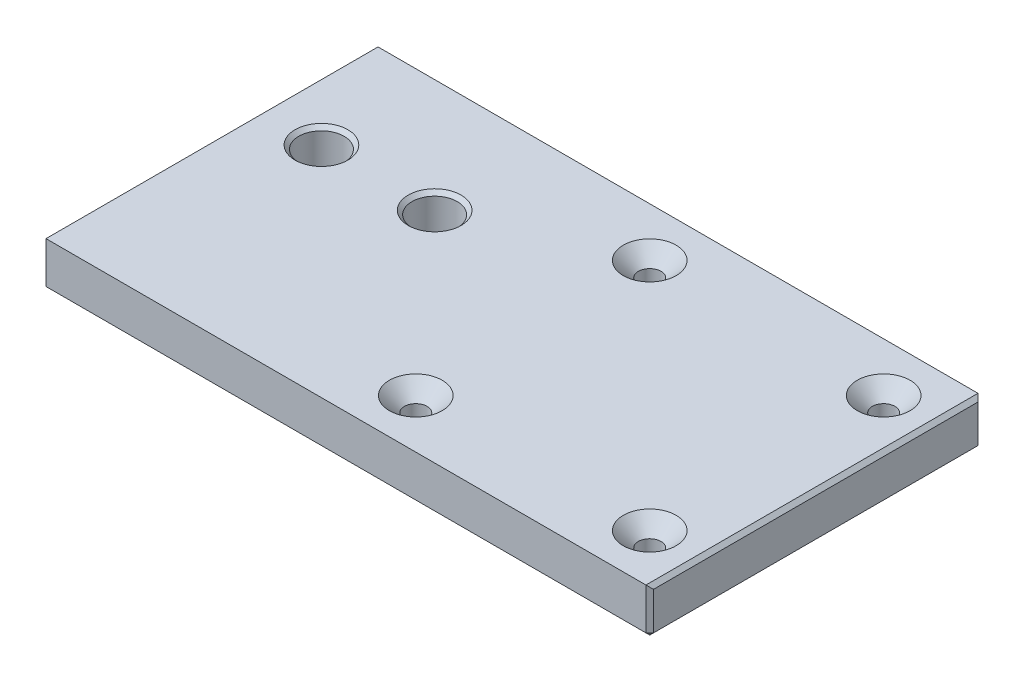
ISO-10303-21;
HEADER;
FILE_DESCRIPTION(('STEP AP214'),'2;1');
FILE_NAME('part.step','',(''),(''),'','','');
FILE_SCHEMA(('AUTOMOTIVE_DESIGN { 1 0 10303 214 1 1 1 1 }'));
ENDSEC;
DATA;
#1=APPLICATION_CONTEXT('core data for automotive mechanical design processes');
#2=APPLICATION_PROTOCOL_DEFINITION('international standard','automotive_design',2000,#1);
#3=PRODUCT_CONTEXT('',#1,'mechanical');
#4=PRODUCT('Part','Part','',(#3));
#5=PRODUCT_RELATED_PRODUCT_CATEGORY('part','',(#4));
#6=PRODUCT_DEFINITION_FORMATION('','',#4);
#7=PRODUCT_DEFINITION_CONTEXT('part definition',#1,'design');
#8=PRODUCT_DEFINITION('design','',#6,#7);
#9=PRODUCT_DEFINITION_SHAPE('','',#8);
#10=(LENGTH_UNIT() NAMED_UNIT(*) SI_UNIT(.MILLI.,.METRE.));
#11=(NAMED_UNIT(*) PLANE_ANGLE_UNIT() SI_UNIT($,.RADIAN.));
#12=(NAMED_UNIT(*) SI_UNIT($,.STERADIAN.) SOLID_ANGLE_UNIT());
#13=UNCERTAINTY_MEASURE_WITH_UNIT(LENGTH_MEASURE(1.E-05),#10,'distance_accuracy_value','');
#14=(GEOMETRIC_REPRESENTATION_CONTEXT(3) GLOBAL_UNCERTAINTY_ASSIGNED_CONTEXT((#13)) GLOBAL_UNIT_ASSIGNED_CONTEXT((#10,
#11,#12)) REPRESENTATION_CONTEXT('',''));
#15=CARTESIAN_POINT('',(0.,0.,0.));
#16=DIRECTION('',(0.,0.,1.));
#17=DIRECTION('',(1.,0.,0.));
#18=AXIS2_PLACEMENT_3D('',#15,#16,#17);
#19=CARTESIAN_POINT('',(0.,6.,0.));
#20=DIRECTION('',(0.,1.,0.));
#21=DIRECTION('',(0.,0.,1.));
#22=AXIS2_PLACEMENT_3D('',#19,#20,#21);
#23=PLANE('',#22);
#24=CARTESIAN_POINT('',(41.2716863076412,6.,16.7214611872146));
#25=DIRECTION('',(0.,1.,0.));
#26=DIRECTION('',(0.,0.,1.));
#27=AXIS2_PLACEMENT_3D('',#24,#25,#26);
#28=CIRCLE('',#27,3.50000000000002);
#29=CARTESIAN_POINT('',(41.2716863076412,6.,20.2214611872146));
#30=VERTEX_POINT('',#29);
#31=EDGE_CURVE('E266',#30,#30,#28,.F.);
#32=ORIENTED_EDGE('',*,*,#31,.T.);
#33=EDGE_LOOP('',(#32));
#34=FACE_BOUND('',#33,.T.);
#35=CARTESIAN_POINT('',(41.2716863076412,6.,-14.2785388127854));
#36=DIRECTION('',(0.,1.,0.));
#37=DIRECTION('',(0.,0.,1.));
#38=AXIS2_PLACEMENT_3D('',#35,#36,#37);
#39=CIRCLE('',#38,3.50000000000002);
#40=CARTESIAN_POINT('',(41.2716863076412,6.,-10.7785388127854));
#41=VERTEX_POINT('',#40);
#42=EDGE_CURVE('E263',#41,#41,#39,.F.);
#43=ORIENTED_EDGE('',*,*,#42,.T.);
#44=EDGE_LOOP('',(#43));
#45=FACE_BOUND('',#44,.T.);
#46=CARTESIAN_POINT('',(10.2716863076412,6.,16.7214611872146));
#47=DIRECTION('',(0.,1.,0.));
#48=DIRECTION('',(0.,0.,1.));
#49=AXIS2_PLACEMENT_3D('',#46,#47,#48);
#50=CIRCLE('',#49,3.50000000000002);
#51=CARTESIAN_POINT('',(10.2716863076412,6.,20.2214611872146));
#52=VERTEX_POINT('',#51);
#53=EDGE_CURVE('E260',#52,#52,#50,.F.);
#54=ORIENTED_EDGE('',*,*,#53,.T.);
#55=EDGE_LOOP('',(#54));
#56=FACE_BOUND('',#55,.T.);
#57=CARTESIAN_POINT('',(10.2716863076412,6.,-14.2785388127854));
#58=DIRECTION('',(0.,1.,0.));
#59=DIRECTION('',(0.,0.,1.));
#60=AXIS2_PLACEMENT_3D('',#57,#58,#59);
#61=CIRCLE('',#60,3.50000000000002);
#62=CARTESIAN_POINT('',(10.2716863076412,6.,-10.7785388127854));
#63=VERTEX_POINT('',#62);
#64=EDGE_CURVE('E257',#63,#63,#61,.F.);
#65=ORIENTED_EDGE('',*,*,#64,.T.);
#66=EDGE_LOOP('',(#65));
#67=FACE_BOUND('',#66,.T.);
#68=CARTESIAN_POINT('',(-9.72831369235883,6.,-5.77853881278539));
#69=DIRECTION('',(0.,1.,0.));
#70=DIRECTION('',(0.,0.,1.));
#71=AXIS2_PLACEMENT_3D('',#68,#69,#70);
#72=CIRCLE('',#71,3.49999999999999);
#73=CARTESIAN_POINT('',(-9.72831369235883,6.,-2.2785388127854));
#74=VERTEX_POINT('',#73);
#75=EDGE_CURVE('E193',#74,#74,#72,.F.);
#76=ORIENTED_EDGE('',*,*,#75,.T.);
#77=EDGE_LOOP('',(#76));
#78=FACE_BOUND('',#77,.T.);
#79=CARTESIAN_POINT('',(-24.7283136923588,6.,-5.77853881278539));
#80=DIRECTION('',(0.,1.,0.));
#81=DIRECTION('',(0.,0.,1.));
#82=AXIS2_PLACEMENT_3D('',#79,#80,#81);
#83=CIRCLE('',#82,3.49999999999999);
#84=CARTESIAN_POINT('',(-24.7283136923588,6.,-2.2785388127854));
#85=VERTEX_POINT('',#84);
#86=EDGE_CURVE('E190',#85,#85,#83,.F.);
#87=ORIENTED_EDGE('',*,*,#86,.T.);
#88=EDGE_LOOP('',(#87));
#89=FACE_BOUND('',#88,.T.);
#90=DIRECTION('',(-1.,0.,0.));
#91=VECTOR('',#90,1.);
#92=CARTESIAN_POINT('',(-32.7283136923588,6.,-20.7785388127854));
#93=LINE('',#92,#91);
#94=CARTESIAN_POINT('',(47.2716863076412,6.,-20.7785388127854));
#95=VERTEX_POINT('',#94);
#96=CARTESIAN_POINT('',(-32.2283136923588,6.,-20.7785388127854));
#97=VERTEX_POINT('',#96);
#98=EDGE_CURVE('E465',#95,#97,#93,.T.);
#99=ORIENTED_EDGE('',*,*,#98,.T.);
#100=DIRECTION('',(0.,0.,1.));
#101=VECTOR('',#100,1.);
#102=CARTESIAN_POINT('',(-32.2283136923588,6.,23.2214611872146));
#103=LINE('',#102,#101);
#104=CARTESIAN_POINT('',(-32.2283136923588,6.,23.2214611872146));
#105=VERTEX_POINT('',#104);
#106=EDGE_CURVE('E198',#97,#105,#103,.T.);
#107=ORIENTED_EDGE('',*,*,#106,.T.);
#108=DIRECTION('',(1.,0.,0.));
#109=VECTOR('',#108,1.);
#110=CARTESIAN_POINT('',(-32.7283136923588,6.,23.2214611872146));
#111=LINE('',#110,#109);
#112=CARTESIAN_POINT('',(47.2716863076412,6.,23.2214611872146));
#113=VERTEX_POINT('',#112);
#114=EDGE_CURVE('E254',#105,#113,#111,.T.);
#115=ORIENTED_EDGE('',*,*,#114,.T.);
#116=DIRECTION('',(0.,0.,-1.));
#117=VECTOR('',#116,1.);
#118=CARTESIAN_POINT('',(47.2716863076412,6.,-20.7785388127854));
#119=LINE('',#118,#117);
#120=EDGE_CURVE('E196',#113,#95,#119,.T.);
#121=ORIENTED_EDGE('',*,*,#120,.T.);
#122=EDGE_LOOP('',(#99,#107,#115,#121));
#123=FACE_BOUND('',#122,.T.);
#124=ADVANCED_FACE('F33',(#34,#45,#56,#67,#78,#89,#123),#23,.T.);
#125=CARTESIAN_POINT('',(0.,0.,0.));
#126=DIRECTION('',(0.,1.,0.));
#127=DIRECTION('',(0.,0.,1.));
#128=AXIS2_PLACEMENT_3D('',#125,#126,#127);
#129=PLANE('',#128);
#130=CARTESIAN_POINT('',(-9.72831369235883,0.,-5.77853881278539));
#131=DIRECTION('',(0.,1.,0.));
#132=DIRECTION('',(0.,0.,1.));
#133=AXIS2_PLACEMENT_3D('',#130,#131,#132);
#134=CIRCLE('',#133,3.5);
#135=CARTESIAN_POINT('',(-9.72831369235883,0.,-2.27853881278539));
#136=VERTEX_POINT('',#135);
#137=EDGE_CURVE('E159',#136,#136,#134,.T.);
#138=ORIENTED_EDGE('',*,*,#137,.T.);
#139=EDGE_LOOP('',(#138));
#140=FACE_BOUND('',#139,.T.);
#141=CARTESIAN_POINT('',(41.2716863076412,0.,16.7214611872146));
#142=DIRECTION('',(0.,1.,0.));
#143=DIRECTION('',(0.,0.,1.));
#144=AXIS2_PLACEMENT_3D('',#141,#142,#143);
#145=CIRCLE('',#144,1.99999999999999);
#146=CARTESIAN_POINT('',(41.2716863076412,0.,18.7214611872146));
#147=VERTEX_POINT('',#146);
#148=EDGE_CURVE('E152',#147,#147,#145,.T.);
#149=ORIENTED_EDGE('',*,*,#148,.T.);
#150=EDGE_LOOP('',(#149));
#151=FACE_BOUND('',#150,.T.);
#152=CARTESIAN_POINT('',(41.2716863076412,0.,-14.2785388127854));
#153=DIRECTION('',(0.,1.,0.));
#154=DIRECTION('',(0.,0.,1.));
#155=AXIS2_PLACEMENT_3D('',#152,#153,#154);
#156=CIRCLE('',#155,2.);
#157=CARTESIAN_POINT('',(41.2716863076412,0.,-12.2785388127854));
#158=VERTEX_POINT('',#157);
#159=EDGE_CURVE('E149',#158,#158,#156,.T.);
#160=ORIENTED_EDGE('',*,*,#159,.T.);
#161=EDGE_LOOP('',(#160));
#162=FACE_BOUND('',#161,.T.);
#163=DIRECTION('',(0.,0.,1.));
#164=VECTOR('',#163,1.);
#165=CARTESIAN_POINT('',(47.2716863076412,0.,0.));
#166=LINE('',#165,#164);
#167=CARTESIAN_POINT('',(47.2716863076412,0.,-20.2785388127854));
#168=VERTEX_POINT('',#167);
#169=CARTESIAN_POINT('',(47.2716863076412,0.,22.7214611872146));
#170=VERTEX_POINT('',#169);
#171=EDGE_CURVE('E147',#168,#170,#166,.T.);
#172=ORIENTED_EDGE('',*,*,#171,.T.);
#173=DIRECTION('',(-1.,0.,0.));
#174=VECTOR('',#173,1.);
#175=CARTESIAN_POINT('',(0.,0.,22.7214611872146));
#176=LINE('',#175,#174);
#177=CARTESIAN_POINT('',(-32.2283136923588,0.,22.7214611872146));
#178=VERTEX_POINT('',#177);
#179=EDGE_CURVE('E139',#170,#178,#176,.T.);
#180=ORIENTED_EDGE('',*,*,#179,.T.);
#181=DIRECTION('',(0.,0.,-1.));
#182=VECTOR('',#181,1.);
#183=CARTESIAN_POINT('',(-32.2283136923588,0.,0.));
#184=LINE('',#183,#182);
#185=CARTESIAN_POINT('',(-32.2283136923588,0.,-20.2785388127854));
#186=VERTEX_POINT('',#185);
#187=EDGE_CURVE('E109',#178,#186,#184,.T.);
#188=ORIENTED_EDGE('',*,*,#187,.T.);
#189=DIRECTION('',(1.,0.,0.));
#190=VECTOR('',#189,1.);
#191=CARTESIAN_POINT('',(0.,0.,-20.2785388127854));
#192=LINE('',#191,#190);
#193=EDGE_CURVE('E121',#186,#168,#192,.T.);
#194=ORIENTED_EDGE('',*,*,#193,.T.);
#195=EDGE_LOOP('',(#172,#180,#188,#194));
#196=FACE_BOUND('',#195,.T.);
#197=CARTESIAN_POINT('',(10.2716863076412,0.,-14.2785388127854));
#198=DIRECTION('',(0.,1.,0.));
#199=DIRECTION('',(0.,0.,1.));
#200=AXIS2_PLACEMENT_3D('',#197,#198,#199);
#201=CIRCLE('',#200,2.);
#202=CARTESIAN_POINT('',(10.2716863076412,0.,-12.2785388127854));
#203=VERTEX_POINT('',#202);
#204=EDGE_CURVE('E122',#203,#203,#201,.T.);
#205=ORIENTED_EDGE('',*,*,#204,.T.);
#206=EDGE_LOOP('',(#205));
#207=FACE_BOUND('',#206,.T.);
#208=CARTESIAN_POINT('',(10.2716863076412,0.,16.7214611872146));
#209=DIRECTION('',(0.,1.,0.));
#210=DIRECTION('',(0.,0.,1.));
#211=AXIS2_PLACEMENT_3D('',#208,#209,#210);
#212=CIRCLE('',#211,1.99999999999999);
#213=CARTESIAN_POINT('',(10.2716863076412,0.,18.7214611872146));
#214=VERTEX_POINT('',#213);
#215=EDGE_CURVE('E448',#214,#214,#212,.T.);
#216=ORIENTED_EDGE('',*,*,#215,.T.);
#217=EDGE_LOOP('',(#216));
#218=FACE_BOUND('',#217,.T.);
#219=CARTESIAN_POINT('',(-24.7283136923588,0.,-5.77853881278539));
#220=DIRECTION('',(0.,1.,0.));
#221=DIRECTION('',(0.,0.,1.));
#222=AXIS2_PLACEMENT_3D('',#219,#220,#221);
#223=CIRCLE('',#222,3.5);
#224=CARTESIAN_POINT('',(-24.7283136923588,0.,-2.27853881278539));
#225=VERTEX_POINT('',#224);
#226=EDGE_CURVE('E451',#225,#225,#223,.T.);
#227=ORIENTED_EDGE('',*,*,#226,.T.);
#228=EDGE_LOOP('',(#227));
#229=FACE_BOUND('',#228,.T.);
#230=ADVANCED_FACE('F144',(#140,#151,#162,#196,#207,#218,#229),#129,.F.);
#231=CARTESIAN_POINT('',(-32.7283136923588,6.,-20.7785388127854));
#232=DIRECTION('',(1.,0.,0.));
#233=DIRECTION('',(0.,0.,-1.));
#234=AXIS2_PLACEMENT_3D('',#231,#232,#233);
#235=PLANE('',#234);
#236=DIRECTION('',(0.,0.,-1.));
#237=VECTOR('',#236,1.);
#238=CARTESIAN_POINT('',(-32.7283136923588,5.5,-20.7785388127854));
#239=LINE('',#238,#237);
#240=CARTESIAN_POINT('',(-32.7283136923588,5.5,22.7214611872146));
#241=VERTEX_POINT('',#240);
#242=CARTESIAN_POINT('',(-32.7283136923588,5.5,-20.2785388127854));
#243=VERTEX_POINT('',#242);
#244=EDGE_CURVE('E178',#241,#243,#239,.T.);
#245=ORIENTED_EDGE('',*,*,#244,.T.);
#246=DIRECTION('',(0.,-1.,0.));
#247=VECTOR('',#246,1.);
#248=CARTESIAN_POINT('',(-32.7283136923588,6.,-20.2785388127854));
#249=LINE('',#248,#247);
#250=CARTESIAN_POINT('',(-32.7283136923588,0.5,-20.2785388127854));
#251=VERTEX_POINT('',#250);
#252=EDGE_CURVE('E180',#243,#251,#249,.T.);
#253=ORIENTED_EDGE('',*,*,#252,.T.);
#254=DIRECTION('',(0.,0.,1.));
#255=VECTOR('',#254,1.);
#256=CARTESIAN_POINT('',(-32.7283136923588,0.5,-20.7785388127854));
#257=LINE('',#256,#255);
#258=CARTESIAN_POINT('',(-32.7283136923588,0.5,22.7214611872146));
#259=VERTEX_POINT('',#258);
#260=EDGE_CURVE('E174',#251,#259,#257,.T.);
#261=ORIENTED_EDGE('',*,*,#260,.T.);
#262=DIRECTION('',(0.,1.,0.));
#263=VECTOR('',#262,1.);
#264=CARTESIAN_POINT('',(-32.7283136923588,6.,22.7214611872146));
#265=LINE('',#264,#263);
#266=EDGE_CURVE('E176',#259,#241,#265,.T.);
#267=ORIENTED_EDGE('',*,*,#266,.T.);
#268=EDGE_LOOP('',(#245,#253,#261,#267));
#269=FACE_BOUND('',#268,.T.);
#270=ADVANCED_FACE('F296',(#269),#235,.F.);
#271=CARTESIAN_POINT('',(-32.7283136923588,6.,23.2214611872146));
#272=DIRECTION('',(0.,0.,-1.));
#273=DIRECTION('',(-1.,0.,0.));
#274=AXIS2_PLACEMENT_3D('',#271,#272,#273);
#275=PLANE('',#274);
#276=ORIENTED_EDGE('',*,*,#114,.F.);
#277=DIRECTION('',(0.,-1.,0.));
#278=VECTOR('',#277,1.);
#279=CARTESIAN_POINT('',(-32.2283136923588,6.,23.2214611872146));
#280=LINE('',#279,#278);
#281=CARTESIAN_POINT('',(-32.2283136923588,0.5,23.2214611872146));
#282=VERTEX_POINT('',#281);
#283=EDGE_CURVE('E203',#105,#282,#280,.T.);
#284=ORIENTED_EDGE('',*,*,#283,.T.);
#285=DIRECTION('',(1.,0.,0.));
#286=VECTOR('',#285,1.);
#287=CARTESIAN_POINT('',(-32.7283136923588,0.5,23.2214611872146));
#288=LINE('',#287,#286);
#289=CARTESIAN_POINT('',(47.2716863076412,0.5,23.2214611872146));
#290=VERTEX_POINT('',#289);
#291=EDGE_CURVE('E140',#282,#290,#288,.T.);
#292=ORIENTED_EDGE('',*,*,#291,.T.);
#293=DIRECTION('',(0.,1.,0.));
#294=VECTOR('',#293,1.);
#295=CARTESIAN_POINT('',(47.2716863076412,6.,23.2214611872146));
#296=LINE('',#295,#294);
#297=EDGE_CURVE('E201',#290,#113,#296,.T.);
#298=ORIENTED_EDGE('',*,*,#297,.T.);
#299=EDGE_LOOP('',(#276,#284,#292,#298));
#300=FACE_BOUND('',#299,.T.);
#301=ADVANCED_FACE('F311',(#300),#275,.F.);
#302=CARTESIAN_POINT('',(47.7716863076412,6.,-20.7785388127854));
#303=DIRECTION('',(-1.,0.,0.));
#304=DIRECTION('',(0.,0.,1.));
#305=AXIS2_PLACEMENT_3D('',#302,#303,#304);
#306=PLANE('',#305);
#307=DIRECTION('',(0.,0.,1.));
#308=VECTOR('',#307,1.);
#309=CARTESIAN_POINT('',(47.7716863076412,5.5,23.2214611872146));
#310=LINE('',#309,#308);
#311=CARTESIAN_POINT('',(47.7716863076412,5.5,-20.2785388127854));
#312=VERTEX_POINT('',#311);
#313=CARTESIAN_POINT('',(47.7716863076412,5.5,22.7214611872146));
#314=VERTEX_POINT('',#313);
#315=EDGE_CURVE('E48',#312,#314,#310,.T.);
#316=ORIENTED_EDGE('',*,*,#315,.T.);
#317=DIRECTION('',(0.,-1.,0.));
#318=VECTOR('',#317,1.);
#319=CARTESIAN_POINT('',(47.7716863076412,6.,22.7214611872146));
#320=LINE('',#319,#318);
#321=CARTESIAN_POINT('',(47.7716863076412,0.5,22.7214611872146));
#322=VERTEX_POINT('',#321);
#323=EDGE_CURVE('E209',#314,#322,#320,.T.);
#324=ORIENTED_EDGE('',*,*,#323,.T.);
#325=DIRECTION('',(0.,0.,-1.));
#326=VECTOR('',#325,1.);
#327=CARTESIAN_POINT('',(47.7716863076412,0.5,-20.7785388127854));
#328=LINE('',#327,#326);
#329=CARTESIAN_POINT('',(47.7716863076412,0.5,-20.2785388127854));
#330=VERTEX_POINT('',#329);
#331=EDGE_CURVE('E205',#322,#330,#328,.T.);
#332=ORIENTED_EDGE('',*,*,#331,.T.);
#333=DIRECTION('',(0.,1.,0.));
#334=VECTOR('',#333,1.);
#335=CARTESIAN_POINT('',(47.7716863076412,6.,-20.2785388127854));
#336=LINE('',#335,#334);
#337=EDGE_CURVE('E53',#330,#312,#336,.T.);
#338=ORIENTED_EDGE('',*,*,#337,.T.);
#339=EDGE_LOOP('',(#316,#324,#332,#338));
#340=FACE_BOUND('',#339,.T.);
#341=ADVANCED_FACE('F307',(#340),#306,.F.);
#342=CARTESIAN_POINT('',(-32.7283136923588,6.,-20.7785388127854));
#343=DIRECTION('',(0.,0.,1.));
#344=DIRECTION('',(1.,0.,0.));
#345=AXIS2_PLACEMENT_3D('',#342,#343,#344);
#346=PLANE('',#345);
#347=DIRECTION('',(-1.,0.,0.));
#348=VECTOR('',#347,1.);
#349=CARTESIAN_POINT('',(-32.7283136923588,0.5,-20.7785388127854));
#350=LINE('',#349,#348);
#351=CARTESIAN_POINT('',(47.2716863076412,0.5,-20.7785388127854));
#352=VERTEX_POINT('',#351);
#353=CARTESIAN_POINT('',(-32.2283136923588,0.5,-20.7785388127854));
#354=VERTEX_POINT('',#353);
#355=EDGE_CURVE('E183',#352,#354,#350,.T.);
#356=ORIENTED_EDGE('',*,*,#355,.T.);
#357=DIRECTION('',(0.,1.,0.));
#358=VECTOR('',#357,1.);
#359=CARTESIAN_POINT('',(-32.2283136923588,6.,-20.7785388127854));
#360=LINE('',#359,#358);
#361=EDGE_CURVE('E187',#354,#97,#360,.T.);
#362=ORIENTED_EDGE('',*,*,#361,.T.);
#363=ORIENTED_EDGE('',*,*,#98,.F.);
#364=DIRECTION('',(0.,-1.,0.));
#365=VECTOR('',#364,1.);
#366=CARTESIAN_POINT('',(47.2716863076412,6.,-20.7785388127854));
#367=LINE('',#366,#365);
#368=EDGE_CURVE('E185',#95,#352,#367,.T.);
#369=ORIENTED_EDGE('',*,*,#368,.T.);
#370=EDGE_LOOP('',(#356,#362,#363,#369));
#371=FACE_BOUND('',#370,.T.);
#372=ADVANCED_FACE('F304',(#371),#346,.F.);
#373=CARTESIAN_POINT('',(10.2716863076412,6.,-14.2785388127854));
#374=DIRECTION('',(0.,-1.,0.));
#375=DIRECTION('',(0.,0.,-1.));
#376=AXIS2_PLACEMENT_3D('',#373,#374,#375);
#377=CYLINDRICAL_SURFACE('',#376,1.5);
#378=CARTESIAN_POINT('',(10.2716863076412,4.00000000000001,-14.2785388127854));
#379=DIRECTION('',(0.,1.,0.));
#380=DIRECTION('',(0.,0.,1.));
#381=AXIS2_PLACEMENT_3D('',#378,#379,#380);
#382=CIRCLE('',#381,1.5);
#383=CARTESIAN_POINT('',(10.2716863076412,4.00000000000001,-12.7785388127854));
#384=VERTEX_POINT('',#383);
#385=EDGE_CURVE('E11',#384,#384,#382,.T.);
#386=ORIENTED_EDGE('',*,*,#385,.T.);
#387=EDGE_LOOP('',(#386));
#388=FACE_BOUND('',#387,.T.);
#389=CARTESIAN_POINT('',(10.2716863076412,0.5,-14.2785388127854));
#390=DIRECTION('',(0.,1.,0.));
#391=DIRECTION('',(0.,0.,1.));
#392=AXIS2_PLACEMENT_3D('',#389,#390,#391);
#393=CIRCLE('',#392,1.5);
#394=CARTESIAN_POINT('',(10.2716863076412,0.5,-12.7785388127854));
#395=VERTEX_POINT('',#394);
#396=EDGE_CURVE('E211',#395,#395,#393,.F.);
#397=ORIENTED_EDGE('',*,*,#396,.T.);
#398=EDGE_LOOP('',(#397));
#399=FACE_BOUND('',#398,.T.);
#400=ADVANCED_FACE('F301',(#388,#399),#377,.F.);
#401=CARTESIAN_POINT('',(41.2716863076412,6.,-14.2785388127854));
#402=DIRECTION('',(0.,-1.,0.));
#403=DIRECTION('',(0.,0.,-1.));
#404=AXIS2_PLACEMENT_3D('',#401,#402,#403);
#405=CYLINDRICAL_SURFACE('',#404,1.5);
#406=CARTESIAN_POINT('',(41.2716863076412,4.00000000000001,-14.2785388127854));
#407=DIRECTION('',(0.,1.,0.));
#408=DIRECTION('',(0.,0.,1.));
#409=AXIS2_PLACEMENT_3D('',#406,#407,#408);
#410=CIRCLE('',#409,1.5);
#411=CARTESIAN_POINT('',(41.2716863076412,4.00000000000001,-12.7785388127854));
#412=VERTEX_POINT('',#411);
#413=EDGE_CURVE('E269',#412,#412,#410,.T.);
#414=ORIENTED_EDGE('',*,*,#413,.T.);
#415=EDGE_LOOP('',(#414));
#416=FACE_BOUND('',#415,.T.);
#417=CARTESIAN_POINT('',(41.2716863076412,0.499999999999996,-14.2785388127854));
#418=DIRECTION('',(0.,1.,0.));
#419=DIRECTION('',(0.,0.,1.));
#420=AXIS2_PLACEMENT_3D('',#417,#418,#419);
#421=CIRCLE('',#420,1.5);
#422=CARTESIAN_POINT('',(41.2716863076412,0.499999999999996,-12.7785388127854));
#423=VERTEX_POINT('',#422);
#424=EDGE_CURVE('E171',#423,#423,#421,.F.);
#425=ORIENTED_EDGE('',*,*,#424,.T.);
#426=EDGE_LOOP('',(#425));
#427=FACE_BOUND('',#426,.T.);
#428=ADVANCED_FACE('F427',(#416,#427),#405,.F.);
#429=CARTESIAN_POINT('',(10.2716863076412,6.,16.7214611872146));
#430=DIRECTION('',(0.,-1.,0.));
#431=DIRECTION('',(0.,0.,-1.));
#432=AXIS2_PLACEMENT_3D('',#429,#430,#431);
#433=CYLINDRICAL_SURFACE('',#432,1.5);
#434=CARTESIAN_POINT('',(10.2716863076412,4.00000000000001,16.7214611872146));
#435=DIRECTION('',(0.,1.,0.));
#436=DIRECTION('',(0.,0.,1.));
#437=AXIS2_PLACEMENT_3D('',#434,#435,#436);
#438=CIRCLE('',#437,1.5);
#439=CARTESIAN_POINT('',(10.2716863076412,4.00000000000001,18.2214611872146));
#440=VERTEX_POINT('',#439);
#441=EDGE_CURVE('E41',#440,#440,#438,.T.);
#442=ORIENTED_EDGE('',*,*,#441,.T.);
#443=EDGE_LOOP('',(#442));
#444=FACE_BOUND('',#443,.T.);
#445=CARTESIAN_POINT('',(10.2716863076412,0.499999999999982,16.7214611872146));
#446=DIRECTION('',(0.,1.,0.));
#447=DIRECTION('',(0.,0.,1.));
#448=AXIS2_PLACEMENT_3D('',#445,#446,#447);
#449=CIRCLE('',#448,1.5);
#450=CARTESIAN_POINT('',(10.2716863076412,0.499999999999982,18.2214611872146));
#451=VERTEX_POINT('',#450);
#452=EDGE_CURVE('E214',#451,#451,#449,.F.);
#453=ORIENTED_EDGE('',*,*,#452,.T.);
#454=EDGE_LOOP('',(#453));
#455=FACE_BOUND('',#454,.T.);
#456=ADVANCED_FACE('F274',(#444,#455),#433,.F.);
#457=CARTESIAN_POINT('',(41.2716863076412,6.,16.7214611872146));
#458=DIRECTION('',(0.,-1.,0.));
#459=DIRECTION('',(0.,0.,-1.));
#460=AXIS2_PLACEMENT_3D('',#457,#458,#459);
#461=CYLINDRICAL_SURFACE('',#460,1.5);
#462=CARTESIAN_POINT('',(41.2716863076412,4.00000000000001,16.7214611872146));
#463=DIRECTION('',(0.,1.,0.));
#464=DIRECTION('',(0.,0.,1.));
#465=AXIS2_PLACEMENT_3D('',#462,#463,#464);
#466=CIRCLE('',#465,1.5);
#467=CARTESIAN_POINT('',(41.2716863076412,4.00000000000001,18.2214611872146));
#468=VERTEX_POINT('',#467);
#469=EDGE_CURVE('E223',#468,#468,#466,.T.);
#470=ORIENTED_EDGE('',*,*,#469,.T.);
#471=EDGE_LOOP('',(#470));
#472=FACE_BOUND('',#471,.T.);
#473=CARTESIAN_POINT('',(41.2716863076412,0.499999999999979,16.7214611872146));
#474=DIRECTION('',(0.,1.,0.));
#475=DIRECTION('',(0.,0.,1.));
#476=AXIS2_PLACEMENT_3D('',#473,#474,#475);
#477=CIRCLE('',#476,1.5);
#478=CARTESIAN_POINT('',(41.2716863076412,0.499999999999979,18.2214611872146));
#479=VERTEX_POINT('',#478);
#480=EDGE_CURVE('E168',#479,#479,#477,.F.);
#481=ORIENTED_EDGE('',*,*,#480,.T.);
#482=EDGE_LOOP('',(#481));
#483=FACE_BOUND('',#482,.T.);
#484=ADVANCED_FACE('F409',(#472,#483),#461,.F.);
#485=CARTESIAN_POINT('',(-24.7283136923588,6.,-5.77853881278539));
#486=DIRECTION('',(0.,-1.,0.));
#487=DIRECTION('',(0.,0.,-1.));
#488=AXIS2_PLACEMENT_3D('',#485,#486,#487);
#489=CYLINDRICAL_SURFACE('',#488,2.99999999999999);
#490=CARTESIAN_POINT('',(-24.7283136923588,0.500000000000006,-5.77853881278539));
#491=DIRECTION('',(0.,1.,0.));
#492=DIRECTION('',(0.,0.,1.));
#493=AXIS2_PLACEMENT_3D('',#490,#491,#492);
#494=CIRCLE('',#493,2.99999999999999);
#495=CARTESIAN_POINT('',(-24.7283136923588,0.500000000000006,-2.7785388127854));
#496=VERTEX_POINT('',#495);
#497=EDGE_CURVE('E220',#496,#496,#494,.F.);
#498=ORIENTED_EDGE('',*,*,#497,.T.);
#499=EDGE_LOOP('',(#498));
#500=FACE_BOUND('',#499,.T.);
#501=CARTESIAN_POINT('',(-24.7283136923588,5.50000000000001,-5.77853881278539));
#502=DIRECTION('',(0.,1.,0.));
#503=DIRECTION('',(0.,0.,1.));
#504=AXIS2_PLACEMENT_3D('',#501,#502,#503);
#505=CIRCLE('',#504,2.99999999999999);
#506=CARTESIAN_POINT('',(-24.7283136923588,5.50000000000001,-2.7785388127854));
#507=VERTEX_POINT('',#506);
#508=EDGE_CURVE('E217',#507,#507,#505,.T.);
#509=ORIENTED_EDGE('',*,*,#508,.T.);
#510=EDGE_LOOP('',(#509));
#511=FACE_BOUND('',#510,.T.);
#512=ADVANCED_FACE('F412',(#500,#511),#489,.F.);
#513=CARTESIAN_POINT('',(-9.72831369235883,6.,-5.77853881278539));
#514=DIRECTION('',(0.,-1.,0.));
#515=DIRECTION('',(0.,0.,-1.));
#516=AXIS2_PLACEMENT_3D('',#513,#514,#515);
#517=CYLINDRICAL_SURFACE('',#516,2.99999999999999);
#518=CARTESIAN_POINT('',(-9.72831369235883,0.500000000000006,-5.77853881278539));
#519=DIRECTION('',(0.,1.,0.));
#520=DIRECTION('',(0.,0.,1.));
#521=AXIS2_PLACEMENT_3D('',#518,#519,#520);
#522=CIRCLE('',#521,2.99999999999999);
#523=CARTESIAN_POINT('',(-9.72831369235883,0.500000000000006,-2.7785388127854));
#524=VERTEX_POINT('',#523);
#525=EDGE_CURVE('E165',#524,#524,#522,.F.);
#526=ORIENTED_EDGE('',*,*,#525,.T.);
#527=EDGE_LOOP('',(#526));
#528=FACE_BOUND('',#527,.T.);
#529=CARTESIAN_POINT('',(-9.72831369235883,5.50000000000001,-5.77853881278539));
#530=DIRECTION('',(0.,1.,0.));
#531=DIRECTION('',(0.,0.,1.));
#532=AXIS2_PLACEMENT_3D('',#529,#530,#531);
#533=CIRCLE('',#532,2.99999999999999);
#534=CARTESIAN_POINT('',(-9.72831369235883,5.50000000000001,-2.7785388127854));
#535=VERTEX_POINT('',#534);
#536=EDGE_CURVE('E162',#535,#535,#533,.T.);
#537=ORIENTED_EDGE('',*,*,#536,.T.);
#538=EDGE_LOOP('',(#537));
#539=FACE_BOUND('',#538,.T.);
#540=ADVANCED_FACE('F322',(#528,#539),#517,.F.);
#541=CARTESIAN_POINT('',(-9.72831369235883,0.,-5.77853881278539));
#542=DIRECTION('',(0.,-1.,0.));
#543=DIRECTION('',(0.,0.,-1.));
#544=AXIS2_PLACEMENT_3D('',#541,#542,#543);
#545=CONICAL_SURFACE('',#544,3.5,0.785398163397452);
#546=ORIENTED_EDGE('',*,*,#525,.F.);
#547=EDGE_LOOP('',(#546));
#548=FACE_BOUND('',#547,.T.);
#549=ORIENTED_EDGE('',*,*,#137,.F.);
#550=EDGE_LOOP('',(#549));
#551=FACE_BOUND('',#550,.T.);
#552=ADVANCED_FACE('F318',(#548,#551),#545,.F.);
#553=CARTESIAN_POINT('',(41.2716863076412,0.,16.7214611872146));
#554=DIRECTION('',(0.,-1.,0.));
#555=DIRECTION('',(0.,0.,-1.));
#556=AXIS2_PLACEMENT_3D('',#553,#554,#555);
#557=CONICAL_SURFACE('',#556,1.99999999999999,0.785398163397453);
#558=ORIENTED_EDGE('',*,*,#480,.F.);
#559=EDGE_LOOP('',(#558));
#560=FACE_BOUND('',#559,.T.);
#561=ORIENTED_EDGE('',*,*,#148,.F.);
#562=EDGE_LOOP('',(#561));
#563=FACE_BOUND('',#562,.T.);
#564=ADVANCED_FACE('F321',(#560,#563),#557,.F.);
#565=CARTESIAN_POINT('',(41.2716863076412,0.,-14.2785388127854));
#566=DIRECTION('',(0.,-1.,0.));
#567=DIRECTION('',(0.,0.,-1.));
#568=AXIS2_PLACEMENT_3D('',#565,#566,#567);
#569=CONICAL_SURFACE('',#568,2.,0.78539816339745);
#570=ORIENTED_EDGE('',*,*,#424,.F.);
#571=EDGE_LOOP('',(#570));
#572=FACE_BOUND('',#571,.T.);
#573=ORIENTED_EDGE('',*,*,#159,.F.);
#574=EDGE_LOOP('',(#573));
#575=FACE_BOUND('',#574,.T.);
#576=ADVANCED_FACE('F326',(#572,#575),#569,.F.);
#577=CARTESIAN_POINT('',(47.7716863076412,6.,22.7214611872146));
#578=DIRECTION('',(-0.707106781186547,0.,-0.707106781186547));
#579=DIRECTION('',(0.,-1.,0.));
#580=AXIS2_PLACEMENT_3D('',#577,#578,#579);
#581=PLANE('',#580);
#582=DIRECTION('',(0.707106781186547,0.,-0.707106781186547));
#583=VECTOR('',#582,1.);
#584=CARTESIAN_POINT('',(47.7716863076412,0.5,22.7214611872146));
#585=LINE('',#584,#583);
#586=EDGE_CURVE('E251',#322,#290,#585,.F.);
#587=ORIENTED_EDGE('',*,*,#586,.F.);
#588=ORIENTED_EDGE('',*,*,#323,.F.);
#589=DIRECTION('',(-0.577350269189627,0.577350269189623,0.577350269189627));
#590=VECTOR('',#589,1.);
#591=CARTESIAN_POINT('',(55.0121733700461,-1.74048706240485,15.4809741248097));
#592=LINE('',#591,#590);
#593=EDGE_CURVE('E248',#113,#314,#592,.F.);
#594=ORIENTED_EDGE('',*,*,#593,.F.);
#595=ORIENTED_EDGE('',*,*,#297,.F.);
#596=EDGE_LOOP('',(#587,#588,#594,#595));
#597=FACE_BOUND('',#596,.T.);
#598=ADVANCED_FACE('F330',(#597),#581,.F.);
#599=CARTESIAN_POINT('',(47.7716863076412,0.5,22.7214611872146));
#600=DIRECTION('',(0.577350269189626,-0.577350269189626,0.577350269189626));
#601=DIRECTION('',(0.707106781186547,0.,-0.707106781186547));
#602=AXIS2_PLACEMENT_3D('',#599,#600,#601);
#603=PLANE('',#602);
#604=DIRECTION('',(-0.70710678118655,-0.707106781186545,0.));
#605=VECTOR('',#604,1.);
#606=CARTESIAN_POINT('',(47.7716863076412,0.5,22.7214611872146));
#607=LINE('',#606,#605);
#608=EDGE_CURVE('E244',#322,#170,#607,.T.);
#609=ORIENTED_EDGE('',*,*,#608,.F.);
#610=ORIENTED_EDGE('',*,*,#586,.T.);
#611=DIRECTION('',(0.,0.707106781186547,0.707106781186547));
#612=VECTOR('',#611,1.);
#613=CARTESIAN_POINT('',(47.2716863076412,0.25,22.9714611872146));
#614=LINE('',#613,#612);
#615=EDGE_CURVE('E246',#170,#290,#614,.T.);
#616=ORIENTED_EDGE('',*,*,#615,.F.);
#617=EDGE_LOOP('',(#609,#610,#616));
#618=FACE_BOUND('',#617,.T.);
#619=ADVANCED_FACE('F374',(#618),#603,.T.);
#620=CARTESIAN_POINT('',(47.2716863076412,6.,0.));
#621=DIRECTION('',(0.707106781186545,0.70710678118655,0.));
#622=DIRECTION('',(0.,0.,1.));
#623=AXIS2_PLACEMENT_3D('',#620,#621,#622);
#624=PLANE('',#623);
#625=ORIENTED_EDGE('',*,*,#593,.T.);
#626=ORIENTED_EDGE('',*,*,#315,.F.);
#627=DIRECTION('',(-0.577350269189627,0.577350269189623,-0.577350269189627));
#628=VECTOR('',#627,1.);
#629=CARTESIAN_POINT('',(47.2716863076412,6.,-20.7785388127854));
#630=LINE('',#629,#628);
#631=EDGE_CURVE('E141',#95,#312,#630,.F.);
#632=ORIENTED_EDGE('',*,*,#631,.F.);
#633=ORIENTED_EDGE('',*,*,#120,.F.);
#634=EDGE_LOOP('',(#625,#626,#632,#633));
#635=FACE_BOUND('',#634,.T.);
#636=ADVANCED_FACE('F371',(#635),#624,.T.);
#637=CARTESIAN_POINT('',(-32.7283136923588,0.5,23.2214611872146));
#638=DIRECTION('',(0.,0.707106781186547,-0.707106781186547));
#639=DIRECTION('',(1.,0.,0.));
#640=AXIS2_PLACEMENT_3D('',#637,#638,#639);
#641=PLANE('',#640);
#642=ORIENTED_EDGE('',*,*,#615,.T.);
#643=ORIENTED_EDGE('',*,*,#291,.F.);
#644=DIRECTION('',(0.,-0.707106781186547,-0.707106781186547));
#645=VECTOR('',#644,1.);
#646=CARTESIAN_POINT('',(-32.2283136923588,0.5,23.2214611872146));
#647=LINE('',#646,#645);
#648=EDGE_CURVE('E128',#178,#282,#647,.F.);
#649=ORIENTED_EDGE('',*,*,#648,.F.);
#650=ORIENTED_EDGE('',*,*,#179,.F.);
#651=EDGE_LOOP('',(#642,#643,#649,#650));
#652=FACE_BOUND('',#651,.T.);
#653=ADVANCED_FACE('F138',(#652),#641,.F.);
#654=CARTESIAN_POINT('',(47.7716863076412,0.5,-20.7785388127854));
#655=DIRECTION('',(-0.707106781186545,0.70710678118655,0.));
#656=DIRECTION('',(0.,0.,-1.));
#657=AXIS2_PLACEMENT_3D('',#654,#655,#656);
#658=PLANE('',#657);
#659=ORIENTED_EDGE('',*,*,#608,.T.);
#660=ORIENTED_EDGE('',*,*,#171,.F.);
#661=DIRECTION('',(0.70710678118655,0.707106781186545,0.));
#662=VECTOR('',#661,1.);
#663=CARTESIAN_POINT('',(47.5216863076412,0.249999999999999,-20.2785388127854));
#664=LINE('',#663,#662);
#665=EDGE_CURVE('E142',#330,#168,#664,.F.);
#666=ORIENTED_EDGE('',*,*,#665,.F.);
#667=ORIENTED_EDGE('',*,*,#331,.F.);
#668=EDGE_LOOP('',(#659,#660,#666,#667));
#669=FACE_BOUND('',#668,.T.);
#670=ADVANCED_FACE('F364',(#669),#658,.F.);
#671=CARTESIAN_POINT('',(47.2716863076412,6.,-20.7785388127854));
#672=DIRECTION('',(-0.707106781186547,0.,0.707106781186547));
#673=DIRECTION('',(0.,-1.,0.));
#674=AXIS2_PLACEMENT_3D('',#671,#672,#673);
#675=PLANE('',#674);
#676=ORIENTED_EDGE('',*,*,#631,.T.);
#677=ORIENTED_EDGE('',*,*,#337,.F.);
#678=DIRECTION('',(-0.707106781186547,0.,-0.707106781186547));
#679=VECTOR('',#678,1.);
#680=CARTESIAN_POINT('',(47.2716863076412,0.5,-20.7785388127854));
#681=LINE('',#680,#679);
#682=EDGE_CURVE('E237',#352,#330,#681,.F.);
#683=ORIENTED_EDGE('',*,*,#682,.F.);
#684=ORIENTED_EDGE('',*,*,#368,.F.);
#685=EDGE_LOOP('',(#676,#677,#683,#684));
#686=FACE_BOUND('',#685,.T.);
#687=ADVANCED_FACE('F361',(#686),#675,.F.);
#688=CARTESIAN_POINT('',(-32.2283136923588,0.5,23.2214611872146));
#689=DIRECTION('',(-0.577350269189626,-0.577350269189626,0.577350269189626));
#690=DIRECTION('',(0.707106781186547,0.,0.707106781186547));
#691=AXIS2_PLACEMENT_3D('',#688,#689,#690);
#692=PLANE('',#691);
#693=DIRECTION('',(-0.707106781186545,0.70710678118655,0.));
#694=VECTOR('',#693,1.);
#695=CARTESIAN_POINT('',(-32.4783136923588,0.250000000000002,22.7214611872146));
#696=LINE('',#695,#694);
#697=EDGE_CURVE('E113',#178,#259,#696,.T.);
#698=ORIENTED_EDGE('',*,*,#697,.F.);
#699=ORIENTED_EDGE('',*,*,#648,.T.);
#700=DIRECTION('',(0.707106781186547,0.,0.707106781186547));
#701=VECTOR('',#700,1.);
#702=CARTESIAN_POINT('',(-32.2283136923588,0.5,23.2214611872146));
#703=LINE('',#702,#701);
#704=EDGE_CURVE('E130',#259,#282,#703,.T.);
#705=ORIENTED_EDGE('',*,*,#704,.F.);
#706=EDGE_LOOP('',(#698,#699,#705));
#707=FACE_BOUND('',#706,.T.);
#708=ADVANCED_FACE('F127',(#707),#692,.T.);
#709=CARTESIAN_POINT('',(47.2716863076412,0.5,-20.7785388127854));
#710=DIRECTION('',(0.577350269189626,-0.577350269189626,-0.577350269189626));
#711=DIRECTION('',(-0.707106781186547,0.,-0.707106781186547));
#712=AXIS2_PLACEMENT_3D('',#709,#710,#711);
#713=PLANE('',#712);
#714=ORIENTED_EDGE('',*,*,#682,.T.);
#715=ORIENTED_EDGE('',*,*,#665,.T.);
#716=DIRECTION('',(0.,-0.707106781186547,0.707106781186547));
#717=VECTOR('',#716,1.);
#718=CARTESIAN_POINT('',(47.2716863076412,0.5,-20.7785388127854));
#719=LINE('',#718,#717);
#720=EDGE_CURVE('E132',#352,#168,#719,.T.);
#721=ORIENTED_EDGE('',*,*,#720,.F.);
#722=EDGE_LOOP('',(#714,#715,#721));
#723=FACE_BOUND('',#722,.T.);
#724=ADVANCED_FACE('F354',(#723),#713,.T.);
#725=CARTESIAN_POINT('',(-32.2283136923588,6.,23.2214611872146));
#726=DIRECTION('',(0.707106781186547,0.,-0.707106781186547));
#727=DIRECTION('',(0.,-1.,0.));
#728=AXIS2_PLACEMENT_3D('',#725,#726,#727);
#729=PLANE('',#728);
#730=ORIENTED_EDGE('',*,*,#704,.T.);
#731=ORIENTED_EDGE('',*,*,#283,.F.);
#732=DIRECTION('',(0.577350269189625,0.577350269189628,0.577350269189625));
#733=VECTOR('',#732,1.);
#734=CARTESIAN_POINT('',(-32.2283136923588,6.,23.2214611872146));
#735=LINE('',#734,#733);
#736=EDGE_CURVE('E231',#241,#105,#735,.T.);
#737=ORIENTED_EDGE('',*,*,#736,.F.);
#738=ORIENTED_EDGE('',*,*,#266,.F.);
#739=EDGE_LOOP('',(#730,#731,#737,#738));
#740=FACE_BOUND('',#739,.T.);
#741=ADVANCED_FACE('F351',(#740),#729,.F.);
#742=CARTESIAN_POINT('',(-32.7283136923588,0.5,-20.7785388127854));
#743=DIRECTION('',(0.70710678118655,0.707106781186545,0.));
#744=DIRECTION('',(0.,0.,1.));
#745=AXIS2_PLACEMENT_3D('',#742,#743,#744);
#746=PLANE('',#745);
#747=ORIENTED_EDGE('',*,*,#697,.T.);
#748=ORIENTED_EDGE('',*,*,#260,.F.);
#749=DIRECTION('',(0.707106781186545,-0.70710678118655,0.));
#750=VECTOR('',#749,1.);
#751=CARTESIAN_POINT('',(-32.7283136923588,0.5,-20.2785388127854));
#752=LINE('',#751,#750);
#753=EDGE_CURVE('E116',#186,#251,#752,.F.);
#754=ORIENTED_EDGE('',*,*,#753,.F.);
#755=ORIENTED_EDGE('',*,*,#187,.F.);
#756=EDGE_LOOP('',(#747,#748,#754,#755));
#757=FACE_BOUND('',#756,.T.);
#758=ADVANCED_FACE('F111',(#757),#746,.F.);
#759=CARTESIAN_POINT('',(-32.7283136923588,0.5,-20.7785388127854));
#760=DIRECTION('',(0.,0.707106781186547,0.707106781186547));
#761=DIRECTION('',(-1.,0.,0.));
#762=AXIS2_PLACEMENT_3D('',#759,#760,#761);
#763=PLANE('',#762);
#764=ORIENTED_EDGE('',*,*,#720,.T.);
#765=ORIENTED_EDGE('',*,*,#193,.F.);
#766=DIRECTION('',(0.,0.707106781186547,-0.707106781186547));
#767=VECTOR('',#766,1.);
#768=CARTESIAN_POINT('',(-32.2283136923588,0.25,-20.5285388127854));
#769=LINE('',#768,#767);
#770=EDGE_CURVE('E228',#354,#186,#769,.F.);
#771=ORIENTED_EDGE('',*,*,#770,.F.);
#772=ORIENTED_EDGE('',*,*,#355,.F.);
#773=EDGE_LOOP('',(#764,#765,#771,#772));
#774=FACE_BOUND('',#773,.T.);
#775=ADVANCED_FACE('F344',(#774),#763,.F.);
#776=CARTESIAN_POINT('',(-32.2283136923588,6.,0.));
#777=DIRECTION('',(-0.70710678118655,0.707106781186545,0.));
#778=DIRECTION('',(0.,0.,-1.));
#779=AXIS2_PLACEMENT_3D('',#776,#777,#778);
#780=PLANE('',#779);
#781=ORIENTED_EDGE('',*,*,#736,.T.);
#782=ORIENTED_EDGE('',*,*,#106,.F.);
#783=DIRECTION('',(0.577350269189625,0.577350269189628,-0.577350269189625));
#784=VECTOR('',#783,1.);
#785=CARTESIAN_POINT('',(-39.1544932966206,-0.926179604261812,-13.8523592085236));
#786=LINE('',#785,#784);
#787=EDGE_CURVE('E226',#243,#97,#786,.T.);
#788=ORIENTED_EDGE('',*,*,#787,.F.);
#789=ORIENTED_EDGE('',*,*,#244,.F.);
#790=EDGE_LOOP('',(#781,#782,#788,#789));
#791=FACE_BOUND('',#790,.T.);
#792=ADVANCED_FACE('F340',(#791),#780,.T.);
#793=CARTESIAN_POINT('',(-32.7283136923588,0.5,-20.2785388127854));
#794=DIRECTION('',(-0.577350269189626,-0.577350269189626,-0.577350269189626));
#795=DIRECTION('',(-0.707106781186547,0.,0.707106781186547));
#796=AXIS2_PLACEMENT_3D('',#793,#794,#795);
#797=PLANE('',#796);
#798=ORIENTED_EDGE('',*,*,#770,.T.);
#799=ORIENTED_EDGE('',*,*,#753,.T.);
#800=DIRECTION('',(-0.707106781186547,0.,0.707106781186547));
#801=VECTOR('',#800,1.);
#802=CARTESIAN_POINT('',(-32.7283136923588,0.5,-20.2785388127854));
#803=LINE('',#802,#801);
#804=EDGE_CURVE('E224',#354,#251,#803,.T.);
#805=ORIENTED_EDGE('',*,*,#804,.F.);
#806=EDGE_LOOP('',(#798,#799,#805));
#807=FACE_BOUND('',#806,.T.);
#808=ADVANCED_FACE('F336',(#807),#797,.T.);
#809=CARTESIAN_POINT('',(-32.7283136923588,6.,-20.2785388127854));
#810=DIRECTION('',(0.707106781186547,0.,0.707106781186547));
#811=DIRECTION('',(0.,-1.,0.));
#812=AXIS2_PLACEMENT_3D('',#809,#810,#811);
#813=PLANE('',#812);
#814=ORIENTED_EDGE('',*,*,#787,.T.);
#815=ORIENTED_EDGE('',*,*,#361,.F.);
#816=ORIENTED_EDGE('',*,*,#804,.T.);
#817=ORIENTED_EDGE('',*,*,#252,.F.);
#818=EDGE_LOOP('',(#814,#815,#816,#817));
#819=FACE_BOUND('',#818,.T.);
#820=ADVANCED_FACE('F332',(#819),#813,.F.);
#821=CARTESIAN_POINT('',(10.2716863076412,0.,-14.2785388127854));
#822=DIRECTION('',(0.,-1.,0.));
#823=DIRECTION('',(0.,0.,-1.));
#824=AXIS2_PLACEMENT_3D('',#821,#822,#823);
#825=CONICAL_SURFACE('',#824,2.,0.78539816339745);
#826=ORIENTED_EDGE('',*,*,#396,.F.);
#827=EDGE_LOOP('',(#826));
#828=FACE_BOUND('',#827,.T.);
#829=ORIENTED_EDGE('',*,*,#204,.F.);
#830=EDGE_LOOP('',(#829));
#831=FACE_BOUND('',#830,.T.);
#832=ADVANCED_FACE('F335',(#828,#831),#825,.F.);
#833=CARTESIAN_POINT('',(10.2716863076412,0.,16.7214611872146));
#834=DIRECTION('',(0.,-1.,0.));
#835=DIRECTION('',(0.,0.,-1.));
#836=AXIS2_PLACEMENT_3D('',#833,#834,#835);
#837=CONICAL_SURFACE('',#836,1.99999999999999,0.785398163397453);
#838=ORIENTED_EDGE('',*,*,#452,.F.);
#839=EDGE_LOOP('',(#838));
#840=FACE_BOUND('',#839,.T.);
#841=ORIENTED_EDGE('',*,*,#215,.F.);
#842=EDGE_LOOP('',(#841));
#843=FACE_BOUND('',#842,.T.);
#844=ADVANCED_FACE('F384',(#840,#843),#837,.F.);
#845=CARTESIAN_POINT('',(-24.7283136923588,0.,-5.77853881278539));
#846=DIRECTION('',(0.,-1.,0.));
#847=DIRECTION('',(0.,0.,-1.));
#848=AXIS2_PLACEMENT_3D('',#845,#846,#847);
#849=CONICAL_SURFACE('',#848,3.5,0.785398163397452);
#850=ORIENTED_EDGE('',*,*,#497,.F.);
#851=EDGE_LOOP('',(#850));
#852=FACE_BOUND('',#851,.T.);
#853=ORIENTED_EDGE('',*,*,#226,.F.);
#854=EDGE_LOOP('',(#853));
#855=FACE_BOUND('',#854,.T.);
#856=ADVANCED_FACE('F388',(#852,#855),#849,.F.);
#857=CARTESIAN_POINT('',(-9.72831369235883,5.50000000000001,-5.77853881278539));
#858=DIRECTION('',(0.,1.,0.));
#859=DIRECTION('',(0.,0.,1.));
#860=AXIS2_PLACEMENT_3D('',#857,#858,#859);
#861=CONICAL_SURFACE('',#860,2.99999999999999,0.785398163397452);
#862=ORIENTED_EDGE('',*,*,#75,.F.);
#863=EDGE_LOOP('',(#862));
#864=FACE_BOUND('',#863,.T.);
#865=ORIENTED_EDGE('',*,*,#536,.F.);
#866=EDGE_LOOP('',(#865));
#867=FACE_BOUND('',#866,.T.);
#868=ADVANCED_FACE('F392',(#864,#867),#861,.F.);
#869=CARTESIAN_POINT('',(-24.7283136923588,5.50000000000001,-5.77853881278539));
#870=DIRECTION('',(0.,1.,0.));
#871=DIRECTION('',(0.,0.,1.));
#872=AXIS2_PLACEMENT_3D('',#869,#870,#871);
#873=CONICAL_SURFACE('',#872,2.99999999999999,0.785398163397452);
#874=ORIENTED_EDGE('',*,*,#86,.F.);
#875=EDGE_LOOP('',(#874));
#876=FACE_BOUND('',#875,.T.);
#877=ORIENTED_EDGE('',*,*,#508,.F.);
#878=EDGE_LOOP('',(#877));
#879=FACE_BOUND('',#878,.T.);
#880=ADVANCED_FACE('F396',(#876,#879),#873,.F.);
#881=CARTESIAN_POINT('',(41.2716863076412,4.00000000000001,16.7214611872146));
#882=DIRECTION('',(0.,1.,0.));
#883=DIRECTION('',(0.,0.,1.));
#884=AXIS2_PLACEMENT_3D('',#881,#882,#883);
#885=CONICAL_SURFACE('',#884,1.5,0.785398163397454);
#886=ORIENTED_EDGE('',*,*,#31,.F.);
#887=EDGE_LOOP('',(#886));
#888=FACE_BOUND('',#887,.T.);
#889=ORIENTED_EDGE('',*,*,#469,.F.);
#890=EDGE_LOOP('',(#889));
#891=FACE_BOUND('',#890,.T.);
#892=ADVANCED_FACE('F286',(#888,#891),#885,.F.);
#893=CARTESIAN_POINT('',(41.2716863076412,4.00000000000001,-14.2785388127854));
#894=DIRECTION('',(0.,1.,0.));
#895=DIRECTION('',(0.,0.,1.));
#896=AXIS2_PLACEMENT_3D('',#893,#894,#895);
#897=CONICAL_SURFACE('',#896,1.5,0.785398163397454);
#898=ORIENTED_EDGE('',*,*,#42,.F.);
#899=EDGE_LOOP('',(#898));
#900=FACE_BOUND('',#899,.T.);
#901=ORIENTED_EDGE('',*,*,#413,.F.);
#902=EDGE_LOOP('',(#901));
#903=FACE_BOUND('',#902,.T.);
#904=ADVANCED_FACE('F279',(#900,#903),#897,.F.);
#905=CARTESIAN_POINT('',(10.2716863076412,4.00000000000001,16.7214611872146));
#906=DIRECTION('',(0.,1.,0.));
#907=DIRECTION('',(0.,0.,1.));
#908=AXIS2_PLACEMENT_3D('',#905,#906,#907);
#909=CONICAL_SURFACE('',#908,1.5,0.785398163397454);
#910=ORIENTED_EDGE('',*,*,#53,.F.);
#911=EDGE_LOOP('',(#910));
#912=FACE_BOUND('',#911,.T.);
#913=ORIENTED_EDGE('',*,*,#441,.F.);
#914=EDGE_LOOP('',(#913));
#915=FACE_BOUND('',#914,.T.);
#916=ADVANCED_FACE('F277',(#912,#915),#909,.F.);
#917=CARTESIAN_POINT('',(10.2716863076412,4.00000000000001,-14.2785388127854));
#918=DIRECTION('',(0.,1.,0.));
#919=DIRECTION('',(0.,0.,1.));
#920=AXIS2_PLACEMENT_3D('',#917,#918,#919);
#921=CONICAL_SURFACE('',#920,1.5,0.785398163397454);
#922=ORIENTED_EDGE('',*,*,#64,.F.);
#923=EDGE_LOOP('',(#922));
#924=FACE_BOUND('',#923,.T.);
#925=ORIENTED_EDGE('',*,*,#385,.F.);
#926=EDGE_LOOP('',(#925));
#927=FACE_BOUND('',#926,.T.);
#928=ADVANCED_FACE('F35',(#924,#927),#921,.F.);
#929=CLOSED_SHELL('',(#124,#230,#270,#301,#341,#372,#400,#428,#456,#484,#512,#540,#552,#564,
#576,#598,#619,#636,#653,#670,#687,#708,#724,#741,#758,#775,#792,#808,#820,#832,#844,#856,#868,
#880,#892,#904,#916,#928));
#930=MANIFOLD_SOLID_BREP('B2',#929);
#931=ADVANCED_BREP_SHAPE_REPRESENTATION('',(#18,#930),#14);
#932=SHAPE_DEFINITION_REPRESENTATION(#9,#931);
ENDSEC;
END-ISO-10303-21;
